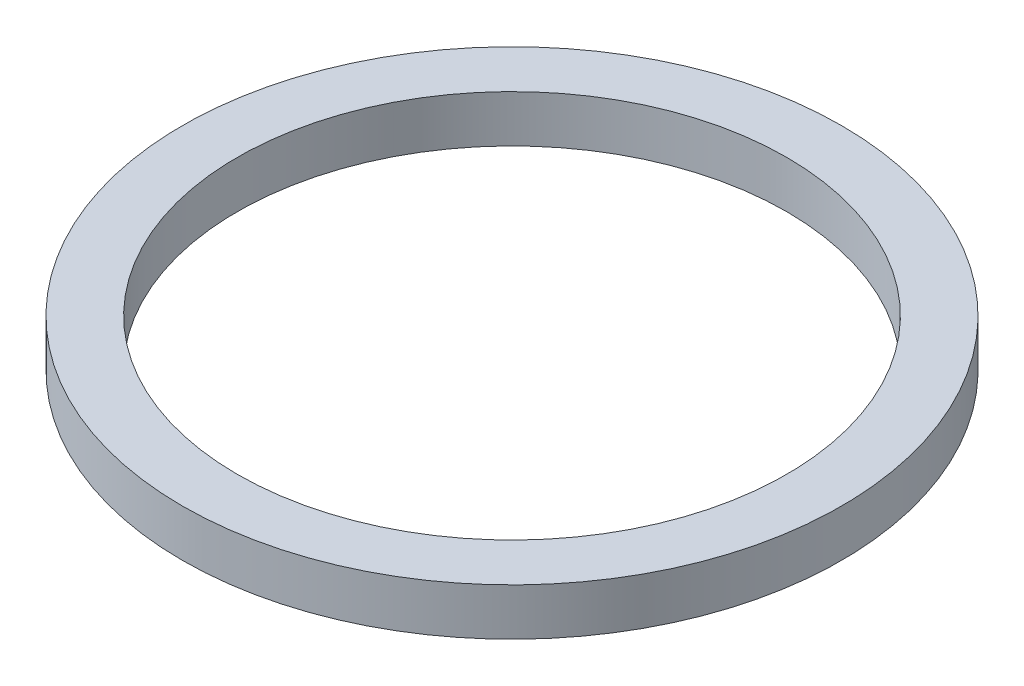
ISO-10303-21;
HEADER;
FILE_DESCRIPTION(('STEP AP214'),'2;1');
FILE_NAME('part.step','',(''),(''),'','','');
FILE_SCHEMA(('AUTOMOTIVE_DESIGN { 1 0 10303 214 1 1 1 1 }'));
ENDSEC;
DATA;
#1=APPLICATION_CONTEXT('core data for automotive mechanical design processes');
#2=APPLICATION_PROTOCOL_DEFINITION('international standard','automotive_design',2000,#1);
#3=PRODUCT_CONTEXT('',#1,'mechanical');
#4=PRODUCT('Part','Part','',(#3));
#5=PRODUCT_RELATED_PRODUCT_CATEGORY('part','',(#4));
#6=PRODUCT_DEFINITION_FORMATION('','',#4);
#7=PRODUCT_DEFINITION_CONTEXT('part definition',#1,'design');
#8=PRODUCT_DEFINITION('design','',#6,#7);
#9=PRODUCT_DEFINITION_SHAPE('','',#8);
#10=(LENGTH_UNIT() NAMED_UNIT(*) SI_UNIT(.MILLI.,.METRE.));
#11=(NAMED_UNIT(*) PLANE_ANGLE_UNIT() SI_UNIT($,.RADIAN.));
#12=(NAMED_UNIT(*) SI_UNIT($,.STERADIAN.) SOLID_ANGLE_UNIT());
#13=UNCERTAINTY_MEASURE_WITH_UNIT(LENGTH_MEASURE(1.E-05),#10,'distance_accuracy_value','');
#14=(GEOMETRIC_REPRESENTATION_CONTEXT(3) GLOBAL_UNCERTAINTY_ASSIGNED_CONTEXT((#13)) GLOBAL_UNIT_ASSIGNED_CONTEXT((#10,
#11,#12)) REPRESENTATION_CONTEXT('',''));
#15=CARTESIAN_POINT('',(0.,0.,0.));
#16=DIRECTION('',(0.,0.,1.));
#17=DIRECTION('',(1.,0.,0.));
#18=AXIS2_PLACEMENT_3D('',#15,#16,#17);
#19=CARTESIAN_POINT('',(0.,1.5,0.));
#20=DIRECTION('',(0.,1.,0.));
#21=DIRECTION('',(0.,0.,1.));
#22=AXIS2_PLACEMENT_3D('',#19,#20,#21);
#23=PLANE('',#22);
#24=CARTESIAN_POINT('',(0.,1.5,0.));
#25=DIRECTION('',(0.,1.,0.));
#26=DIRECTION('',(0.,0.,1.));
#27=AXIS2_PLACEMENT_3D('',#24,#25,#26);
#28=CIRCLE('',#27,10.5);
#29=CARTESIAN_POINT('',(0.,1.5,10.5));
#30=VERTEX_POINT('',#29);
#31=EDGE_CURVE('E10',#30,#30,#28,.T.);
#32=ORIENTED_EDGE('',*,*,#31,.T.);
#33=EDGE_LOOP('',(#32));
#34=FACE_BOUND('',#33,.T.);
#35=CARTESIAN_POINT('',(0.,1.5,0.));
#36=DIRECTION('',(0.,1.,0.));
#37=DIRECTION('',(0.,0.,1.));
#38=AXIS2_PLACEMENT_3D('',#35,#36,#37);
#39=CIRCLE('',#38,8.75);
#40=CARTESIAN_POINT('',(0.,1.5,8.75));
#41=VERTEX_POINT('',#40);
#42=EDGE_CURVE('E59',#41,#41,#39,.T.);
#43=ORIENTED_EDGE('',*,*,#42,.F.);
#44=EDGE_LOOP('',(#43));
#45=FACE_BOUND('',#44,.T.);
#46=ADVANCED_FACE('F45',(#34,#45),#23,.T.);
#47=CARTESIAN_POINT('',(0.,0.,0.));
#48=DIRECTION('',(0.,1.,0.));
#49=DIRECTION('',(0.,0.,1.));
#50=AXIS2_PLACEMENT_3D('',#47,#48,#49);
#51=PLANE('',#50);
#52=CARTESIAN_POINT('',(0.,0.,0.));
#53=DIRECTION('',(0.,1.,0.));
#54=DIRECTION('',(0.,0.,1.));
#55=AXIS2_PLACEMENT_3D('',#52,#53,#54);
#56=CIRCLE('',#55,10.5);
#57=CARTESIAN_POINT('',(0.,0.,10.5));
#58=VERTEX_POINT('',#57);
#59=EDGE_CURVE('E49',#58,#58,#56,.T.);
#60=ORIENTED_EDGE('',*,*,#59,.F.);
#61=EDGE_LOOP('',(#60));
#62=FACE_BOUND('',#61,.T.);
#63=CARTESIAN_POINT('',(0.,0.,0.));
#64=DIRECTION('',(0.,1.,0.));
#65=DIRECTION('',(0.,0.,1.));
#66=AXIS2_PLACEMENT_3D('',#63,#64,#65);
#67=CIRCLE('',#66,8.75);
#68=CARTESIAN_POINT('',(0.,0.,8.75));
#69=VERTEX_POINT('',#68);
#70=EDGE_CURVE('E61',#69,#69,#67,.T.);
#71=ORIENTED_EDGE('',*,*,#70,.T.);
#72=EDGE_LOOP('',(#71));
#73=FACE_BOUND('',#72,.T.);
#74=ADVANCED_FACE('F72',(#62,#73),#51,.F.);
#75=CARTESIAN_POINT('',(0.,1.5,0.));
#76=DIRECTION('',(0.,-1.,0.));
#77=DIRECTION('',(0.,0.,-1.));
#78=AXIS2_PLACEMENT_3D('',#75,#76,#77);
#79=CYLINDRICAL_SURFACE('',#78,10.5);
#80=ORIENTED_EDGE('',*,*,#31,.F.);
#81=EDGE_LOOP('',(#80));
#82=FACE_BOUND('',#81,.T.);
#83=ORIENTED_EDGE('',*,*,#59,.T.);
#84=EDGE_LOOP('',(#83));
#85=FACE_BOUND('',#84,.T.);
#86=ADVANCED_FACE('F47',(#82,#85),#79,.T.);
#87=CARTESIAN_POINT('',(0.,1.5,0.));
#88=DIRECTION('',(0.,-1.,0.));
#89=DIRECTION('',(0.,0.,-1.));
#90=AXIS2_PLACEMENT_3D('',#87,#88,#89);
#91=CYLINDRICAL_SURFACE('',#90,8.75);
#92=ORIENTED_EDGE('',*,*,#42,.T.);
#93=EDGE_LOOP('',(#92));
#94=FACE_BOUND('',#93,.T.);
#95=ORIENTED_EDGE('',*,*,#70,.F.);
#96=EDGE_LOOP('',(#95));
#97=FACE_BOUND('',#96,.T.);
#98=ADVANCED_FACE('F68',(#94,#97),#91,.F.);
#99=CLOSED_SHELL('',(#46,#74,#86,#98));
#100=MANIFOLD_SOLID_BREP('B2',#99);
#101=ADVANCED_BREP_SHAPE_REPRESENTATION('',(#18,#100),#14);
#102=SHAPE_DEFINITION_REPRESENTATION(#9,#101);
ENDSEC;
END-ISO-10303-21;
